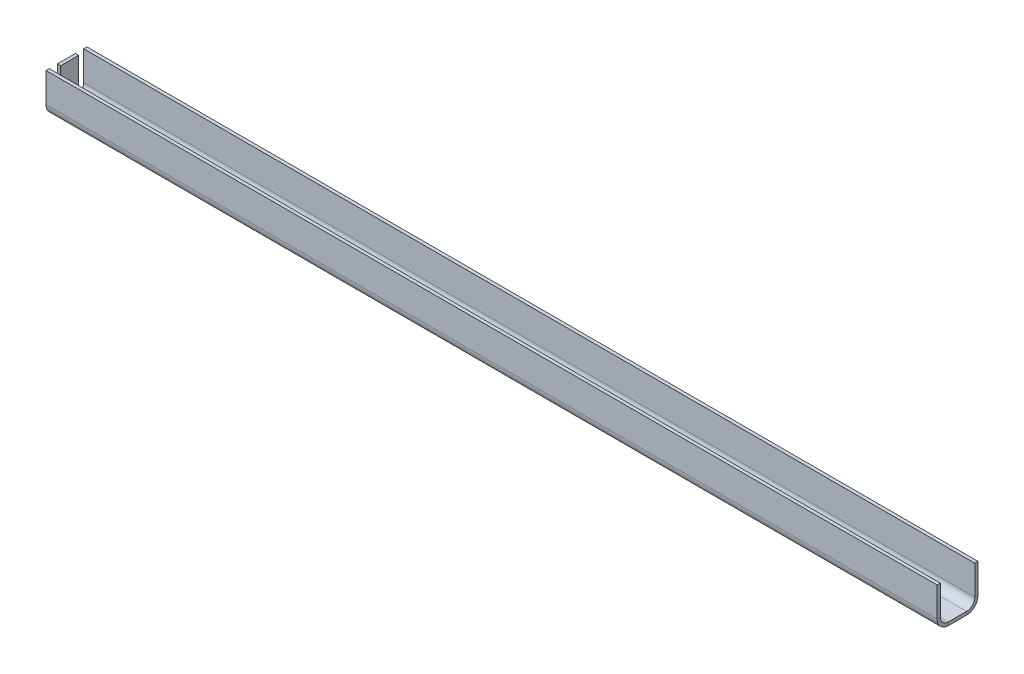
ISO-10303-21;
HEADER;
FILE_DESCRIPTION(('STEP AP214'),'2;1');
FILE_NAME('part.step','',(''),(''),'','','');
FILE_SCHEMA(('AUTOMOTIVE_DESIGN { 1 0 10303 214 1 1 1 1 }'));
ENDSEC;
DATA;
#1=APPLICATION_CONTEXT('core data for automotive mechanical design processes');
#2=APPLICATION_PROTOCOL_DEFINITION('international standard','automotive_design',2000,#1);
#3=PRODUCT_CONTEXT('',#1,'mechanical');
#4=PRODUCT('Part','Part','',(#3));
#5=PRODUCT_RELATED_PRODUCT_CATEGORY('part','',(#4));
#6=PRODUCT_DEFINITION_FORMATION('','',#4);
#7=PRODUCT_DEFINITION_CONTEXT('part definition',#1,'design');
#8=PRODUCT_DEFINITION('design','',#6,#7);
#9=PRODUCT_DEFINITION_SHAPE('','',#8);
#10=(LENGTH_UNIT() NAMED_UNIT(*) SI_UNIT(.MILLI.,.METRE.));
#11=(NAMED_UNIT(*) PLANE_ANGLE_UNIT() SI_UNIT($,.RADIAN.));
#12=(NAMED_UNIT(*) SI_UNIT($,.STERADIAN.) SOLID_ANGLE_UNIT());
#13=UNCERTAINTY_MEASURE_WITH_UNIT(LENGTH_MEASURE(1.E-05),#10,'distance_accuracy_value','');
#14=(GEOMETRIC_REPRESENTATION_CONTEXT(3) GLOBAL_UNCERTAINTY_ASSIGNED_CONTEXT((#13)) GLOBAL_UNIT_ASSIGNED_CONTEXT((#10,
#11,#12)) REPRESENTATION_CONTEXT('',''));
#15=CARTESIAN_POINT('',(0.,0.,0.));
#16=DIRECTION('',(0.,0.,1.));
#17=DIRECTION('',(1.,0.,0.));
#18=AXIS2_PLACEMENT_3D('',#15,#16,#17);
#19=CARTESIAN_POINT('',(-138.43,0.,2.81));
#20=DIRECTION('',(0.,0.,-1.));
#21=DIRECTION('',(-1.,0.,0.));
#22=AXIS2_PLACEMENT_3D('',#19,#20,#21);
#23=PLANE('',#22);
#24=DIRECTION('',(1.,0.,0.));
#25=VECTOR('',#24,1.);
#26=CARTESIAN_POINT('',(-138.43,0.,2.81));
#27=LINE('',#26,#25);
#28=CARTESIAN_POINT('',(-138.43,0.,2.81));
#29=VERTEX_POINT('',#28);
#30=CARTESIAN_POINT('',(-137.355765601188,0.,2.80999999999999));
#31=VERTEX_POINT('',#30);
#32=EDGE_CURVE('E487',#29,#31,#27,.T.);
#33=ORIENTED_EDGE('',*,*,#32,.T.);
#34=CARTESIAN_POINT('',(-134.89,2.53999999999996,2.80999999999999));
#35=DIRECTION('',(0.,0.,1.));
#36=DIRECTION('',(1.,0.,0.));
#37=AXIS2_PLACEMENT_3D('',#34,#35,#36);
#38=CIRCLE('',#37,3.54000000000001);
#39=CARTESIAN_POINT('',(-134.89,-1.00000000000005,2.80999999999999));
#40=VERTEX_POINT('',#39);
#41=EDGE_CURVE('E13',#31,#40,#38,.T.);
#42=ORIENTED_EDGE('',*,*,#41,.T.);
#43=DIRECTION('',(1.,0.,0.));
#44=VECTOR('',#43,1.);
#45=CARTESIAN_POINT('',(138.43,-1.00000000000001,2.80999999999912));
#46=LINE('',#45,#44);
#47=CARTESIAN_POINT('',(-138.43,-1.00000000000001,2.81));
#48=VERTEX_POINT('',#47);
#49=EDGE_CURVE('E489',#48,#40,#46,.T.);
#50=ORIENTED_EDGE('',*,*,#49,.F.);
#51=DIRECTION('',(0.,-1.,0.));
#52=VECTOR('',#51,1.);
#53=CARTESIAN_POINT('',(-138.43,0.,2.81));
#54=LINE('',#53,#52);
#55=EDGE_CURVE('E188',#29,#48,#54,.T.);
#56=ORIENTED_EDGE('',*,*,#55,.F.);
#57=EDGE_LOOP('',(#33,#42,#50,#56));
#58=FACE_BOUND('',#57,.T.);
#59=ADVANCED_FACE('F95',(#58),#23,.T.);
#60=CARTESIAN_POINT('',(-134.89,0.,-2.81000000000001));
#61=DIRECTION('',(0.,0.,1.));
#62=DIRECTION('',(0.,-1.,0.));
#63=AXIS2_PLACEMENT_3D('',#60,#61,#62);
#64=PLANE('',#63);
#65=DIRECTION('',(-1.,0.,0.));
#66=VECTOR('',#65,1.);
#67=CARTESIAN_POINT('',(-138.43,-1.00000000000003,-2.81000000000001));
#68=LINE('',#67,#66);
#69=CARTESIAN_POINT('',(-138.43,-1.00000000000003,-2.81000000000001));
#70=VERTEX_POINT('',#69);
#71=CARTESIAN_POINT('',(-134.89,-1.00000000000005,-2.81000000000001));
#72=VERTEX_POINT('',#71);
#73=EDGE_CURVE('E189',#70,#72,#68,.F.);
#74=ORIENTED_EDGE('',*,*,#73,.T.);
#75=CARTESIAN_POINT('',(-134.89,2.53999999999996,-2.81000000000001));
#76=DIRECTION('',(0.,0.,1.));
#77=DIRECTION('',(1.,0.,0.));
#78=AXIS2_PLACEMENT_3D('',#75,#76,#77);
#79=CIRCLE('',#78,3.54000000000001);
#80=CARTESIAN_POINT('',(-137.355765601188,0.,-2.81000000000001));
#81=VERTEX_POINT('',#80);
#82=EDGE_CURVE('E473',#72,#81,#79,.F.);
#83=ORIENTED_EDGE('',*,*,#82,.T.);
#84=DIRECTION('',(-1.,0.,0.));
#85=VECTOR('',#84,1.);
#86=CARTESIAN_POINT('',(-138.43,0.,-2.81000000000001));
#87=LINE('',#86,#85);
#88=CARTESIAN_POINT('',(-138.43,0.,-2.81000000000001));
#89=VERTEX_POINT('',#88);
#90=EDGE_CURVE('E197',#89,#81,#87,.F.);
#91=ORIENTED_EDGE('',*,*,#90,.F.);
#92=DIRECTION('',(0.,-1.,0.));
#93=VECTOR('',#92,1.);
#94=CARTESIAN_POINT('',(-138.43,0.,-2.81000000000001));
#95=LINE('',#94,#93);
#96=EDGE_CURVE('E161',#89,#70,#95,.T.);
#97=ORIENTED_EDGE('',*,*,#96,.T.);
#98=EDGE_LOOP('',(#74,#83,#91,#97));
#99=FACE_BOUND('',#98,.T.);
#100=ADVANCED_FACE('F227',(#99),#64,.T.);
#101=CARTESIAN_POINT('',(0.,-1.,0.));
#102=DIRECTION('',(0.,-1.,0.));
#103=DIRECTION('',(0.,0.,-1.));
#104=AXIS2_PLACEMENT_3D('',#101,#102,#103);
#105=PLANE('',#104);
#106=DIRECTION('',(1.,0.,0.));
#107=VECTOR('',#106,1.);
#108=CARTESIAN_POINT('',(138.43,-1.00000000000001,2.81));
#109=LINE('',#108,#107);
#110=CARTESIAN_POINT('',(138.43,-1.00000000000001,2.81));
#111=VERTEX_POINT('',#110);
#112=EDGE_CURVE('E304',#111,#40,#109,.F.);
#113=ORIENTED_EDGE('',*,*,#112,.T.);
#114=DIRECTION('',(0.,0.,1.));
#115=VECTOR('',#114,1.);
#116=CARTESIAN_POINT('',(-134.89,-1.00000000000005,2.81));
#117=LINE('',#116,#115);
#118=EDGE_CURVE('E307',#40,#72,#117,.F.);
#119=ORIENTED_EDGE('',*,*,#118,.T.);
#120=CARTESIAN_POINT('',(138.43,-1.,-2.81000000000001));
#121=VERTEX_POINT('',#120);
#122=EDGE_CURVE('E113',#72,#121,#68,.F.);
#123=ORIENTED_EDGE('',*,*,#122,.T.);
#124=DIRECTION('',(0.,0.,-1.));
#125=VECTOR('',#124,1.);
#126=CARTESIAN_POINT('',(138.43,-1.,6.35));
#127=LINE('',#126,#125);
#128=EDGE_CURVE('E104',#111,#121,#127,.T.);
#129=ORIENTED_EDGE('',*,*,#128,.F.);
#130=EDGE_LOOP('',(#113,#119,#123,#129));
#131=FACE_BOUND('',#130,.T.);
#132=ADVANCED_FACE('F225',(#131),#105,.T.);
#133=CARTESIAN_POINT('',(0.,0.,0.));
#134=DIRECTION('',(0.,-1.,0.));
#135=DIRECTION('',(0.,0.,-1.));
#136=AXIS2_PLACEMENT_3D('',#133,#134,#135);
#137=PLANE('',#136);
#138=DIRECTION('',(0.,0.,1.));
#139=VECTOR('',#138,1.);
#140=CARTESIAN_POINT('',(-134.89,0.,2.81));
#141=LINE('',#140,#139);
#142=CARTESIAN_POINT('',(-134.89,0.,2.80999999999999));
#143=VERTEX_POINT('',#142);
#144=CARTESIAN_POINT('',(-134.89,0.,-2.81000000000001));
#145=VERTEX_POINT('',#144);
#146=EDGE_CURVE('E481',#143,#145,#141,.F.);
#147=ORIENTED_EDGE('',*,*,#146,.F.);
#148=DIRECTION('',(1.,0.,0.));
#149=VECTOR('',#148,1.);
#150=CARTESIAN_POINT('',(138.43,0.,2.81));
#151=LINE('',#150,#149);
#152=CARTESIAN_POINT('',(138.43,0.,2.81));
#153=VERTEX_POINT('',#152);
#154=EDGE_CURVE('E216',#153,#143,#151,.F.);
#155=ORIENTED_EDGE('',*,*,#154,.F.);
#156=DIRECTION('',(0.,0.,-1.));
#157=VECTOR('',#156,1.);
#158=CARTESIAN_POINT('',(138.43,0.,6.35));
#159=LINE('',#158,#157);
#160=CARTESIAN_POINT('',(138.43,0.,-2.81000000000001));
#161=VERTEX_POINT('',#160);
#162=EDGE_CURVE('E99',#153,#161,#159,.T.);
#163=ORIENTED_EDGE('',*,*,#162,.T.);
#164=EDGE_CURVE('E162',#145,#161,#87,.F.);
#165=ORIENTED_EDGE('',*,*,#164,.F.);
#166=EDGE_LOOP('',(#147,#155,#163,#165));
#167=FACE_BOUND('',#166,.T.);
#168=ADVANCED_FACE('F212',(#167),#137,.F.);
#169=CARTESIAN_POINT('',(138.43,-1.,6.35));
#170=DIRECTION('',(1.,0.,0.));
#171=DIRECTION('',(0.,0.,-1.));
#172=AXIS2_PLACEMENT_3D('',#169,#170,#171);
#173=PLANE('',#172);
#174=ORIENTED_EDGE('',*,*,#162,.F.);
#175=DIRECTION('',(0.,-1.,0.));
#176=VECTOR('',#175,1.);
#177=CARTESIAN_POINT('',(138.43,0.,2.81));
#178=LINE('',#177,#176);
#179=EDGE_CURVE('E318',#153,#111,#178,.T.);
#180=ORIENTED_EDGE('',*,*,#179,.T.);
#181=ORIENTED_EDGE('',*,*,#128,.T.);
#182=DIRECTION('',(0.,-1.,0.));
#183=VECTOR('',#182,1.);
#184=CARTESIAN_POINT('',(138.43,0.,-2.81000000000001));
#185=LINE('',#184,#183);
#186=EDGE_CURVE('E200',#161,#121,#185,.T.);
#187=ORIENTED_EDGE('',*,*,#186,.F.);
#188=EDGE_LOOP('',(#174,#180,#181,#187));
#189=FACE_BOUND('',#188,.T.);
#190=ADVANCED_FACE('F97',(#189),#173,.T.);
#191=CARTESIAN_POINT('',(138.43,2.53999999999997,-2.81000000000001));
#192=DIRECTION('',(1.,0.,0.));
#193=DIRECTION('',(0.,0.,-1.));
#194=AXIS2_PLACEMENT_3D('',#191,#192,#193);
#195=PLANE('',#194);
#196=DIRECTION('',(0.,0.,1.));
#197=VECTOR('',#196,1.);
#198=CARTESIAN_POINT('',(138.43,2.54,-6.34999999999998));
#199=LINE('',#198,#197);
#200=CARTESIAN_POINT('',(138.43,2.53999999999996,-5.35000000000001));
#201=VERTEX_POINT('',#200);
#202=CARTESIAN_POINT('',(138.43,2.53999999999996,-6.35000000000001));
#203=VERTEX_POINT('',#202);
#204=EDGE_CURVE('E152',#201,#203,#199,.F.);
#205=ORIENTED_EDGE('',*,*,#204,.F.);
#206=CARTESIAN_POINT('',(138.43,2.53999999999997,-2.81000000000001));
#207=DIRECTION('',(-1.,0.,0.));
#208=DIRECTION('',(0.,0.,1.));
#209=AXIS2_PLACEMENT_3D('',#206,#207,#208);
#210=CIRCLE('',#209,2.54);
#211=EDGE_CURVE('E146',#161,#201,#210,.F.);
#212=ORIENTED_EDGE('',*,*,#211,.F.);
#213=ORIENTED_EDGE('',*,*,#186,.T.);
#214=CARTESIAN_POINT('',(138.43,2.53999999999997,-2.81000000000001));
#215=DIRECTION('',(-1.,0.,0.));
#216=DIRECTION('',(0.,0.,1.));
#217=AXIS2_PLACEMENT_3D('',#214,#215,#216);
#218=CIRCLE('',#217,3.54);
#219=EDGE_CURVE('E192',#121,#203,#218,.F.);
#220=ORIENTED_EDGE('',*,*,#219,.T.);
#221=EDGE_LOOP('',(#205,#212,#213,#220));
#222=FACE_BOUND('',#221,.T.);
#223=ADVANCED_FACE('F218',(#222),#195,.T.);
#224=CARTESIAN_POINT('',(-138.43,2.53999999999997,-2.81000000000001));
#225=DIRECTION('',(1.,0.,0.));
#226=DIRECTION('',(0.,0.,-1.));
#227=AXIS2_PLACEMENT_3D('',#224,#225,#226);
#228=PLANE('',#227);
#229=CARTESIAN_POINT('',(-138.43,2.53999999999997,-2.81000000000001));
#230=DIRECTION('',(-1.,0.,0.));
#231=DIRECTION('',(0.,0.,1.));
#232=AXIS2_PLACEMENT_3D('',#229,#230,#231);
#233=CIRCLE('',#232,2.54);
#234=CARTESIAN_POINT('',(-138.43,2.53999999999996,-5.35000000000001));
#235=VERTEX_POINT('',#234);
#236=EDGE_CURVE('E144',#235,#89,#233,.T.);
#237=ORIENTED_EDGE('',*,*,#236,.F.);
#238=DIRECTION('',(0.,0.,1.));
#239=VECTOR('',#238,1.);
#240=CARTESIAN_POINT('',(-138.43,2.53999999999999,-5.35000000000001));
#241=LINE('',#240,#239);
#242=CARTESIAN_POINT('',(-138.43,2.53999999999999,-6.35000000000001));
#243=VERTEX_POINT('',#242);
#244=EDGE_CURVE('E151',#235,#243,#241,.F.);
#245=ORIENTED_EDGE('',*,*,#244,.T.);
#246=CARTESIAN_POINT('',(-138.43,2.53999999999997,-2.81000000000001));
#247=DIRECTION('',(-1.,0.,0.));
#248=DIRECTION('',(0.,0.,1.));
#249=AXIS2_PLACEMENT_3D('',#246,#247,#248);
#250=CIRCLE('',#249,3.54);
#251=EDGE_CURVE('E194',#243,#70,#250,.T.);
#252=ORIENTED_EDGE('',*,*,#251,.T.);
#253=ORIENTED_EDGE('',*,*,#96,.F.);
#254=EDGE_LOOP('',(#237,#245,#252,#253));
#255=FACE_BOUND('',#254,.T.);
#256=ADVANCED_FACE('F158',(#255),#228,.F.);
#257=CARTESIAN_POINT('',(-138.43,2.53999999999997,-2.81000000000001));
#258=DIRECTION('',(-1.,0.,0.));
#259=DIRECTION('',(0.,0.,-1.));
#260=AXIS2_PLACEMENT_3D('',#257,#258,#259);
#261=CYLINDRICAL_SURFACE('',#260,3.54);
#262=ORIENTED_EDGE('',*,*,#73,.F.);
#263=ORIENTED_EDGE('',*,*,#251,.F.);
#264=DIRECTION('',(-1.,0.,0.));
#265=VECTOR('',#264,1.);
#266=CARTESIAN_POINT('',(138.43,2.54,-6.35000000000001));
#267=LINE('',#266,#265);
#268=EDGE_CURVE('E122',#243,#203,#267,.F.);
#269=ORIENTED_EDGE('',*,*,#268,.T.);
#270=ORIENTED_EDGE('',*,*,#219,.F.);
#271=ORIENTED_EDGE('',*,*,#122,.F.);
#272=EDGE_LOOP('',(#262,#263,#269,#270,#271));
#273=FACE_BOUND('',#272,.T.);
#274=ADVANCED_FACE('F291',(#273),#261,.T.);
#275=CARTESIAN_POINT('',(-138.43,2.53999999999997,-2.81000000000001));
#276=DIRECTION('',(-1.,0.,0.));
#277=DIRECTION('',(0.,0.,-1.));
#278=AXIS2_PLACEMENT_3D('',#275,#276,#277);
#279=CYLINDRICAL_SURFACE('',#278,2.54);
#280=ORIENTED_EDGE('',*,*,#90,.T.);
#281=EDGE_CURVE('E198',#81,#145,#87,.F.);
#282=ORIENTED_EDGE('',*,*,#281,.T.);
#283=ORIENTED_EDGE('',*,*,#164,.T.);
#284=ORIENTED_EDGE('',*,*,#211,.T.);
#285=DIRECTION('',(-1.,0.,0.));
#286=VECTOR('',#285,1.);
#287=CARTESIAN_POINT('',(138.43,2.53999999999999,-5.35000000000001));
#288=LINE('',#287,#286);
#289=EDGE_CURVE('E139',#201,#235,#288,.T.);
#290=ORIENTED_EDGE('',*,*,#289,.T.);
#291=ORIENTED_EDGE('',*,*,#236,.T.);
#292=EDGE_LOOP('',(#280,#282,#283,#284,#290,#291));
#293=FACE_BOUND('',#292,.T.);
#294=ADVANCED_FACE('F142',(#293),#279,.F.);
#295=CARTESIAN_POINT('',(-138.43,11.7,-6.35000000000004));
#296=DIRECTION('',(1.,0.,0.));
#297=DIRECTION('',(0.,0.,-1.));
#298=AXIS2_PLACEMENT_3D('',#295,#296,#297);
#299=PLANE('',#298);
#300=ORIENTED_EDGE('',*,*,#244,.F.);
#301=DIRECTION('',(0.,-1.,0.));
#302=VECTOR('',#301,1.);
#303=CARTESIAN_POINT('',(-138.43,11.7,-5.35000000000004));
#304=LINE('',#303,#302);
#305=CARTESIAN_POINT('',(-138.43,11.7,-5.35000000000004));
#306=VERTEX_POINT('',#305);
#307=EDGE_CURVE('E171',#235,#306,#304,.F.);
#308=ORIENTED_EDGE('',*,*,#307,.T.);
#309=DIRECTION('',(0.,0.,1.));
#310=VECTOR('',#309,1.);
#311=CARTESIAN_POINT('',(-138.43,11.7,-6.35000000000004));
#312=LINE('',#311,#310);
#313=CARTESIAN_POINT('',(-138.43,11.7,-6.35000000000004));
#314=VERTEX_POINT('',#313);
#315=EDGE_CURVE('E163',#314,#306,#312,.T.);
#316=ORIENTED_EDGE('',*,*,#315,.F.);
#317=DIRECTION('',(0.,1.,0.));
#318=VECTOR('',#317,1.);
#319=CARTESIAN_POINT('',(-138.43,0.,-6.35));
#320=LINE('',#319,#318);
#321=EDGE_CURVE('E174',#243,#314,#320,.T.);
#322=ORIENTED_EDGE('',*,*,#321,.F.);
#323=EDGE_LOOP('',(#300,#308,#316,#322));
#324=FACE_BOUND('',#323,.T.);
#325=ADVANCED_FACE('F168',(#324),#299,.F.);
#326=CARTESIAN_POINT('',(138.43,0.,-6.35));
#327=DIRECTION('',(-1.,0.,0.));
#328=DIRECTION('',(0.,0.,1.));
#329=AXIS2_PLACEMENT_3D('',#326,#327,#328);
#330=PLANE('',#329);
#331=ORIENTED_EDGE('',*,*,#204,.T.);
#332=DIRECTION('',(0.,-1.,0.));
#333=VECTOR('',#332,1.);
#334=CARTESIAN_POINT('',(138.43,0.,-6.35));
#335=LINE('',#334,#333);
#336=CARTESIAN_POINT('',(138.43,11.7,-6.35000000000004));
#337=VERTEX_POINT('',#336);
#338=EDGE_CURVE('E340',#337,#203,#335,.T.);
#339=ORIENTED_EDGE('',*,*,#338,.F.);
#340=DIRECTION('',(0.,0.,1.));
#341=VECTOR('',#340,1.);
#342=CARTESIAN_POINT('',(138.43,11.7,-6.35000000000004));
#343=LINE('',#342,#341);
#344=CARTESIAN_POINT('',(138.43,11.7,-5.35000000000004));
#345=VERTEX_POINT('',#344);
#346=EDGE_CURVE('E337',#337,#345,#343,.T.);
#347=ORIENTED_EDGE('',*,*,#346,.T.);
#348=DIRECTION('',(0.,1.,0.));
#349=VECTOR('',#348,1.);
#350=CARTESIAN_POINT('',(138.43,0.,-5.35));
#351=LINE('',#350,#349);
#352=EDGE_CURVE('E181',#345,#201,#351,.F.);
#353=ORIENTED_EDGE('',*,*,#352,.T.);
#354=EDGE_LOOP('',(#331,#339,#347,#353));
#355=FACE_BOUND('',#354,.T.);
#356=ADVANCED_FACE('F279',(#355),#330,.F.);
#357=CARTESIAN_POINT('',(0.,0.,-6.35));
#358=DIRECTION('',(0.,0.,1.));
#359=DIRECTION('',(0.,-1.,0.));
#360=AXIS2_PLACEMENT_3D('',#357,#358,#359);
#361=PLANE('',#360);
#362=ORIENTED_EDGE('',*,*,#268,.F.);
#363=ORIENTED_EDGE('',*,*,#321,.T.);
#364=DIRECTION('',(1.,0.,0.));
#365=VECTOR('',#364,1.);
#366=CARTESIAN_POINT('',(0.,11.7,-6.35000000000004));
#367=LINE('',#366,#365);
#368=EDGE_CURVE('E343',#314,#337,#367,.T.);
#369=ORIENTED_EDGE('',*,*,#368,.T.);
#370=ORIENTED_EDGE('',*,*,#338,.T.);
#371=EDGE_LOOP('',(#362,#363,#369,#370));
#372=FACE_BOUND('',#371,.T.);
#373=ADVANCED_FACE('F276',(#372),#361,.F.);
#374=CARTESIAN_POINT('',(0.,0.,-5.35));
#375=DIRECTION('',(0.,0.,1.));
#376=DIRECTION('',(0.,-1.,0.));
#377=AXIS2_PLACEMENT_3D('',#374,#375,#376);
#378=PLANE('',#377);
#379=ORIENTED_EDGE('',*,*,#307,.F.);
#380=ORIENTED_EDGE('',*,*,#289,.F.);
#381=ORIENTED_EDGE('',*,*,#352,.F.);
#382=DIRECTION('',(-1.,0.,0.));
#383=VECTOR('',#382,1.);
#384=CARTESIAN_POINT('',(138.43,11.7,-5.35000000000004));
#385=LINE('',#384,#383);
#386=EDGE_CURVE('E179',#306,#345,#385,.F.);
#387=ORIENTED_EDGE('',*,*,#386,.F.);
#388=EDGE_LOOP('',(#379,#380,#381,#387));
#389=FACE_BOUND('',#388,.T.);
#390=ADVANCED_FACE('F177',(#389),#378,.T.);
#391=CARTESIAN_POINT('',(138.43,11.7,-6.35000000000004));
#392=DIRECTION('',(0.,-1.,0.));
#393=DIRECTION('',(0.,0.,-1.));
#394=AXIS2_PLACEMENT_3D('',#391,#392,#393);
#395=PLANE('',#394);
#396=ORIENTED_EDGE('',*,*,#386,.T.);
#397=ORIENTED_EDGE('',*,*,#346,.F.);
#398=ORIENTED_EDGE('',*,*,#368,.F.);
#399=ORIENTED_EDGE('',*,*,#315,.T.);
#400=EDGE_LOOP('',(#396,#397,#398,#399));
#401=FACE_BOUND('',#400,.T.);
#402=ADVANCED_FACE('F271',(#401),#395,.F.);
#403=CARTESIAN_POINT('',(-138.43,2.54,2.81));
#404=DIRECTION('',(-1.,0.,0.));
#405=DIRECTION('',(0.,0.,1.));
#406=AXIS2_PLACEMENT_3D('',#403,#404,#405);
#407=PLANE('',#406);
#408=DIRECTION('',(0.,0.,-1.));
#409=VECTOR('',#408,1.);
#410=CARTESIAN_POINT('',(-138.43,2.53999999999999,6.35));
#411=LINE('',#410,#409);
#412=CARTESIAN_POINT('',(-138.43,2.54,5.35));
#413=VERTEX_POINT('',#412);
#414=CARTESIAN_POINT('',(-138.43,2.54,6.35));
#415=VERTEX_POINT('',#414);
#416=EDGE_CURVE('E323',#413,#415,#411,.F.);
#417=ORIENTED_EDGE('',*,*,#416,.F.);
#418=CARTESIAN_POINT('',(-138.43,2.54,2.81));
#419=DIRECTION('',(1.,0.,0.));
#420=DIRECTION('',(0.,0.,-1.));
#421=AXIS2_PLACEMENT_3D('',#418,#419,#420);
#422=CIRCLE('',#421,2.54);
#423=EDGE_CURVE('E320',#29,#413,#422,.F.);
#424=ORIENTED_EDGE('',*,*,#423,.F.);
#425=ORIENTED_EDGE('',*,*,#55,.T.);
#426=CARTESIAN_POINT('',(-138.43,2.54,2.81));
#427=DIRECTION('',(1.,0.,0.));
#428=DIRECTION('',(0.,0.,-1.));
#429=AXIS2_PLACEMENT_3D('',#426,#427,#428);
#430=CIRCLE('',#429,3.54);
#431=EDGE_CURVE('E314',#48,#415,#430,.F.);
#432=ORIENTED_EDGE('',*,*,#431,.T.);
#433=EDGE_LOOP('',(#417,#424,#425,#432));
#434=FACE_BOUND('',#433,.T.);
#435=ADVANCED_FACE('F268',(#434),#407,.T.);
#436=CARTESIAN_POINT('',(138.43,2.54,2.81));
#437=DIRECTION('',(-1.,0.,0.));
#438=DIRECTION('',(0.,0.,1.));
#439=AXIS2_PLACEMENT_3D('',#436,#437,#438);
#440=PLANE('',#439);
#441=CARTESIAN_POINT('',(138.43,2.54,2.81));
#442=DIRECTION('',(1.,0.,0.));
#443=DIRECTION('',(0.,0.,-1.));
#444=AXIS2_PLACEMENT_3D('',#441,#442,#443);
#445=CIRCLE('',#444,2.54);
#446=CARTESIAN_POINT('',(138.43,2.54,5.35));
#447=VERTEX_POINT('',#446);
#448=EDGE_CURVE('E329',#447,#153,#445,.T.);
#449=ORIENTED_EDGE('',*,*,#448,.F.);
#450=DIRECTION('',(0.,0.,-1.));
#451=VECTOR('',#450,1.);
#452=CARTESIAN_POINT('',(138.43,2.54,5.35000000000001));
#453=LINE('',#452,#451);
#454=CARTESIAN_POINT('',(138.43,2.54,6.35));
#455=VERTEX_POINT('',#454);
#456=EDGE_CURVE('E512',#447,#455,#453,.F.);
#457=ORIENTED_EDGE('',*,*,#456,.T.);
#458=CARTESIAN_POINT('',(138.43,2.54,2.81));
#459=DIRECTION('',(1.,0.,0.));
#460=DIRECTION('',(0.,0.,-1.));
#461=AXIS2_PLACEMENT_3D('',#458,#459,#460);
#462=CIRCLE('',#461,3.54);
#463=EDGE_CURVE('E315',#455,#111,#462,.T.);
#464=ORIENTED_EDGE('',*,*,#463,.T.);
#465=ORIENTED_EDGE('',*,*,#179,.F.);
#466=EDGE_LOOP('',(#449,#457,#464,#465));
#467=FACE_BOUND('',#466,.T.);
#468=ADVANCED_FACE('F263',(#467),#440,.F.);
#469=CARTESIAN_POINT('',(138.43,2.54,2.81));
#470=DIRECTION('',(1.,0.,0.));
#471=DIRECTION('',(0.,0.,1.));
#472=AXIS2_PLACEMENT_3D('',#469,#470,#471);
#473=CYLINDRICAL_SURFACE('',#472,3.54);
#474=ORIENTED_EDGE('',*,*,#112,.F.);
#475=ORIENTED_EDGE('',*,*,#463,.F.);
#476=DIRECTION('',(1.,0.,0.));
#477=VECTOR('',#476,1.);
#478=CARTESIAN_POINT('',(-138.43,2.53999999999999,6.35));
#479=LINE('',#478,#477);
#480=EDGE_CURVE('E510',#455,#415,#479,.F.);
#481=ORIENTED_EDGE('',*,*,#480,.T.);
#482=ORIENTED_EDGE('',*,*,#431,.F.);
#483=ORIENTED_EDGE('',*,*,#49,.T.);
#484=EDGE_LOOP('',(#474,#475,#481,#482,#483));
#485=FACE_BOUND('',#484,.T.);
#486=ADVANCED_FACE('F260',(#485),#473,.T.);
#487=CARTESIAN_POINT('',(138.43,2.54,2.81));
#488=DIRECTION('',(1.,0.,0.));
#489=DIRECTION('',(0.,0.,1.));
#490=AXIS2_PLACEMENT_3D('',#487,#488,#489);
#491=CYLINDRICAL_SURFACE('',#490,2.54);
#492=ORIENTED_EDGE('',*,*,#154,.T.);
#493=EDGE_CURVE('E475',#31,#143,#27,.T.);
#494=ORIENTED_EDGE('',*,*,#493,.F.);
#495=ORIENTED_EDGE('',*,*,#32,.F.);
#496=ORIENTED_EDGE('',*,*,#423,.T.);
#497=DIRECTION('',(1.,0.,0.));
#498=VECTOR('',#497,1.);
#499=CARTESIAN_POINT('',(-138.43,2.53999999999999,5.35));
#500=LINE('',#499,#498);
#501=EDGE_CURVE('E514',#413,#447,#500,.T.);
#502=ORIENTED_EDGE('',*,*,#501,.T.);
#503=ORIENTED_EDGE('',*,*,#448,.T.);
#504=EDGE_LOOP('',(#492,#494,#495,#496,#502,#503));
#505=FACE_BOUND('',#504,.T.);
#506=ADVANCED_FACE('F258',(#505),#491,.F.);
#507=CARTESIAN_POINT('',(138.43,11.7,6.35));
#508=DIRECTION('',(-1.,0.,0.));
#509=DIRECTION('',(0.,0.,1.));
#510=AXIS2_PLACEMENT_3D('',#507,#508,#509);
#511=PLANE('',#510);
#512=ORIENTED_EDGE('',*,*,#456,.F.);
#513=DIRECTION('',(0.,-1.,0.));
#514=VECTOR('',#513,1.);
#515=CARTESIAN_POINT('',(138.43,11.7,5.35));
#516=LINE('',#515,#514);
#517=CARTESIAN_POINT('',(138.43,11.7,5.35));
#518=VERTEX_POINT('',#517);
#519=EDGE_CURVE('E508',#447,#518,#516,.F.);
#520=ORIENTED_EDGE('',*,*,#519,.T.);
#521=DIRECTION('',(0.,0.,-1.));
#522=VECTOR('',#521,1.);
#523=CARTESIAN_POINT('',(138.43,11.7,6.35));
#524=LINE('',#523,#522);
#525=CARTESIAN_POINT('',(138.43,11.7,6.35));
#526=VERTEX_POINT('',#525);
#527=EDGE_CURVE('E332',#526,#518,#524,.T.);
#528=ORIENTED_EDGE('',*,*,#527,.F.);
#529=DIRECTION('',(0.,1.,0.));
#530=VECTOR('',#529,1.);
#531=CARTESIAN_POINT('',(138.43,0.,6.35));
#532=LINE('',#531,#530);
#533=EDGE_CURVE('E501',#455,#526,#532,.T.);
#534=ORIENTED_EDGE('',*,*,#533,.F.);
#535=EDGE_LOOP('',(#512,#520,#528,#534));
#536=FACE_BOUND('',#535,.T.);
#537=ADVANCED_FACE('F250',(#536),#511,.F.);
#538=CARTESIAN_POINT('',(-138.43,0.,6.35));
#539=DIRECTION('',(1.,0.,0.));
#540=DIRECTION('',(0.,0.,-1.));
#541=AXIS2_PLACEMENT_3D('',#538,#539,#540);
#542=PLANE('',#541);
#543=ORIENTED_EDGE('',*,*,#416,.T.);
#544=DIRECTION('',(0.,-1.,0.));
#545=VECTOR('',#544,1.);
#546=CARTESIAN_POINT('',(-138.43,0.,6.35));
#547=LINE('',#546,#545);
#548=CARTESIAN_POINT('',(-138.43,11.7,6.35));
#549=VERTEX_POINT('',#548);
#550=EDGE_CURVE('E496',#549,#415,#547,.T.);
#551=ORIENTED_EDGE('',*,*,#550,.F.);
#552=DIRECTION('',(0.,0.,-1.));
#553=VECTOR('',#552,1.);
#554=CARTESIAN_POINT('',(-138.43,11.7,6.35));
#555=LINE('',#554,#553);
#556=CARTESIAN_POINT('',(-138.43,11.7,5.35));
#557=VERTEX_POINT('',#556);
#558=EDGE_CURVE('E493',#549,#557,#555,.T.);
#559=ORIENTED_EDGE('',*,*,#558,.T.);
#560=DIRECTION('',(0.,1.,0.));
#561=VECTOR('',#560,1.);
#562=CARTESIAN_POINT('',(-138.43,0.,5.35));
#563=LINE('',#562,#561);
#564=EDGE_CURVE('E503',#557,#413,#563,.F.);
#565=ORIENTED_EDGE('',*,*,#564,.T.);
#566=EDGE_LOOP('',(#543,#551,#559,#565));
#567=FACE_BOUND('',#566,.T.);
#568=ADVANCED_FACE('F242',(#567),#542,.F.);
#569=CARTESIAN_POINT('',(0.,0.,6.35));
#570=DIRECTION('',(0.,0.,-1.));
#571=DIRECTION('',(-1.,0.,0.));
#572=AXIS2_PLACEMENT_3D('',#569,#570,#571);
#573=PLANE('',#572);
#574=ORIENTED_EDGE('',*,*,#480,.F.);
#575=ORIENTED_EDGE('',*,*,#533,.T.);
#576=DIRECTION('',(-1.,0.,0.));
#577=VECTOR('',#576,1.);
#578=CARTESIAN_POINT('',(0.,11.7,6.35));
#579=LINE('',#578,#577);
#580=EDGE_CURVE('E499',#526,#549,#579,.T.);
#581=ORIENTED_EDGE('',*,*,#580,.T.);
#582=ORIENTED_EDGE('',*,*,#550,.T.);
#583=EDGE_LOOP('',(#574,#575,#581,#582));
#584=FACE_BOUND('',#583,.T.);
#585=ADVANCED_FACE('F238',(#584),#573,.F.);
#586=CARTESIAN_POINT('',(0.,0.,5.35));
#587=DIRECTION('',(0.,0.,-1.));
#588=DIRECTION('',(-1.,0.,0.));
#589=AXIS2_PLACEMENT_3D('',#586,#587,#588);
#590=PLANE('',#589);
#591=ORIENTED_EDGE('',*,*,#519,.F.);
#592=ORIENTED_EDGE('',*,*,#501,.F.);
#593=ORIENTED_EDGE('',*,*,#564,.F.);
#594=DIRECTION('',(1.,0.,0.));
#595=VECTOR('',#594,1.);
#596=CARTESIAN_POINT('',(-138.43,11.7,5.35));
#597=LINE('',#596,#595);
#598=EDGE_CURVE('E506',#518,#557,#597,.F.);
#599=ORIENTED_EDGE('',*,*,#598,.F.);
#600=EDGE_LOOP('',(#591,#592,#593,#599));
#601=FACE_BOUND('',#600,.T.);
#602=ADVANCED_FACE('F241',(#601),#590,.T.);
#603=CARTESIAN_POINT('',(-138.43,11.7,6.35));
#604=DIRECTION('',(0.,-1.,0.));
#605=DIRECTION('',(0.,0.,-1.));
#606=AXIS2_PLACEMENT_3D('',#603,#604,#605);
#607=PLANE('',#606);
#608=ORIENTED_EDGE('',*,*,#598,.T.);
#609=ORIENTED_EDGE('',*,*,#558,.F.);
#610=ORIENTED_EDGE('',*,*,#580,.F.);
#611=ORIENTED_EDGE('',*,*,#527,.T.);
#612=EDGE_LOOP('',(#608,#609,#610,#611));
#613=FACE_BOUND('',#612,.T.);
#614=ADVANCED_FACE('F246',(#613),#607,.F.);
#615=CARTESIAN_POINT('',(-134.89,2.53999999999996,-2.81000000000001));
#616=DIRECTION('',(0.,0.,-1.));
#617=DIRECTION('',(-1.,0.,0.));
#618=AXIS2_PLACEMENT_3D('',#615,#616,#617);
#619=PLANE('',#618);
#620=ORIENTED_EDGE('',*,*,#281,.F.);
#621=CARTESIAN_POINT('',(-138.43,2.53999999999996,-2.81000000000001));
#622=VERTEX_POINT('',#621);
#623=EDGE_CURVE('E472',#81,#622,#79,.F.);
#624=ORIENTED_EDGE('',*,*,#623,.T.);
#625=DIRECTION('',(1.,0.,0.));
#626=VECTOR('',#625,1.);
#627=CARTESIAN_POINT('',(-138.43,2.53999999999996,-2.81000000000002));
#628=LINE('',#627,#626);
#629=CARTESIAN_POINT('',(-137.43,2.53999999999996,-2.81000000000001));
#630=VERTEX_POINT('',#629);
#631=EDGE_CURVE('E452',#630,#622,#628,.F.);
#632=ORIENTED_EDGE('',*,*,#631,.F.);
#633=CARTESIAN_POINT('',(-134.89,2.53999999999996,-2.81000000000001));
#634=DIRECTION('',(0.,0.,1.));
#635=DIRECTION('',(1.,0.,0.));
#636=AXIS2_PLACEMENT_3D('',#633,#634,#635);
#637=CIRCLE('',#636,2.54000000000001);
#638=EDGE_CURVE('E478',#145,#630,#637,.F.);
#639=ORIENTED_EDGE('',*,*,#638,.F.);
#640=EDGE_LOOP('',(#620,#624,#632,#639));
#641=FACE_BOUND('',#640,.T.);
#642=ADVANCED_FACE('F254',(#641),#619,.T.);
#643=CARTESIAN_POINT('',(-134.89,2.53999999999996,2.80999999999999));
#644=DIRECTION('',(0.,0.,-1.));
#645=DIRECTION('',(-1.,0.,0.));
#646=AXIS2_PLACEMENT_3D('',#643,#644,#645);
#647=PLANE('',#646);
#648=CARTESIAN_POINT('',(-138.43,2.53999999999996,2.80999999999999));
#649=VERTEX_POINT('',#648);
#650=EDGE_CURVE('E106',#649,#31,#38,.T.);
#651=ORIENTED_EDGE('',*,*,#650,.T.);
#652=ORIENTED_EDGE('',*,*,#493,.T.);
#653=CARTESIAN_POINT('',(-134.89,2.53999999999996,2.80999999999999));
#654=DIRECTION('',(0.,0.,1.));
#655=DIRECTION('',(1.,0.,0.));
#656=AXIS2_PLACEMENT_3D('',#653,#654,#655);
#657=CIRCLE('',#656,2.54000000000001);
#658=CARTESIAN_POINT('',(-137.43,2.53999999999996,2.80999999999999));
#659=VERTEX_POINT('',#658);
#660=EDGE_CURVE('E484',#659,#143,#657,.T.);
#661=ORIENTED_EDGE('',*,*,#660,.F.);
#662=DIRECTION('',(1.,0.,0.));
#663=VECTOR('',#662,1.);
#664=CARTESIAN_POINT('',(-137.43,2.53999999999996,2.80999999999999));
#665=LINE('',#664,#663);
#666=EDGE_CURVE('E465',#659,#649,#665,.F.);
#667=ORIENTED_EDGE('',*,*,#666,.T.);
#668=EDGE_LOOP('',(#651,#652,#661,#667));
#669=FACE_BOUND('',#668,.T.);
#670=ADVANCED_FACE('F536',(#669),#647,.F.);
#671=CARTESIAN_POINT('',(-134.89,2.53999999999996,2.81));
#672=DIRECTION('',(0.,0.,1.));
#673=DIRECTION('',(-1.,0.,0.));
#674=AXIS2_PLACEMENT_3D('',#671,#672,#673);
#675=CYLINDRICAL_SURFACE('',#674,3.54000000000001);
#676=ORIENTED_EDGE('',*,*,#118,.F.);
#677=ORIENTED_EDGE('',*,*,#41,.F.);
#678=ORIENTED_EDGE('',*,*,#650,.F.);
#679=DIRECTION('',(0.,0.,1.));
#680=VECTOR('',#679,1.);
#681=CARTESIAN_POINT('',(-138.43,2.53999999999996,-2.81000000000003));
#682=LINE('',#681,#680);
#683=EDGE_CURVE('E462',#649,#622,#682,.F.);
#684=ORIENTED_EDGE('',*,*,#683,.T.);
#685=ORIENTED_EDGE('',*,*,#623,.F.);
#686=ORIENTED_EDGE('',*,*,#82,.F.);
#687=EDGE_LOOP('',(#676,#677,#678,#684,#685,#686));
#688=FACE_BOUND('',#687,.T.);
#689=ADVANCED_FACE('F535',(#688),#675,.T.);
#690=CARTESIAN_POINT('',(-134.89,2.53999999999996,2.81));
#691=DIRECTION('',(0.,0.,1.));
#692=DIRECTION('',(-1.,0.,0.));
#693=AXIS2_PLACEMENT_3D('',#690,#691,#692);
#694=CYLINDRICAL_SURFACE('',#693,2.54000000000001);
#695=ORIENTED_EDGE('',*,*,#146,.T.);
#696=ORIENTED_EDGE('',*,*,#638,.T.);
#697=DIRECTION('',(0.,0.,1.));
#698=VECTOR('',#697,1.);
#699=CARTESIAN_POINT('',(-137.43,2.53999999999996,-2.81000000000003));
#700=LINE('',#699,#698);
#701=EDGE_CURVE('E468',#630,#659,#700,.T.);
#702=ORIENTED_EDGE('',*,*,#701,.T.);
#703=ORIENTED_EDGE('',*,*,#660,.T.);
#704=EDGE_LOOP('',(#695,#696,#702,#703));
#705=FACE_BOUND('',#704,.T.);
#706=ADVANCED_FACE('F546',(#705),#694,.F.);
#707=CARTESIAN_POINT('',(-138.43,11.7,2.80999999999995));
#708=DIRECTION('',(0.,0.,-1.));
#709=DIRECTION('',(0.,1.,0.));
#710=AXIS2_PLACEMENT_3D('',#707,#708,#709);
#711=PLANE('',#710);
#712=ORIENTED_EDGE('',*,*,#666,.F.);
#713=DIRECTION('',(0.,-1.,0.));
#714=VECTOR('',#713,1.);
#715=CARTESIAN_POINT('',(-137.43,11.7,2.80999999999995));
#716=LINE('',#715,#714);
#717=CARTESIAN_POINT('',(-137.43,11.7,2.80999999999995));
#718=VERTEX_POINT('',#717);
#719=EDGE_CURVE('E460',#659,#718,#716,.F.);
#720=ORIENTED_EDGE('',*,*,#719,.T.);
#721=DIRECTION('',(1.,0.,0.));
#722=VECTOR('',#721,1.);
#723=CARTESIAN_POINT('',(-138.43,11.7,2.80999999999995));
#724=LINE('',#723,#722);
#725=CARTESIAN_POINT('',(-138.43,11.7,2.80999999999995));
#726=VERTEX_POINT('',#725);
#727=EDGE_CURVE('E448',#726,#718,#724,.T.);
#728=ORIENTED_EDGE('',*,*,#727,.F.);
#729=DIRECTION('',(0.,1.,0.));
#730=VECTOR('',#729,1.);
#731=CARTESIAN_POINT('',(-138.43,-3.1990689669406E-13,2.81));
#732=LINE('',#731,#730);
#733=EDGE_CURVE('E435',#649,#726,#732,.T.);
#734=ORIENTED_EDGE('',*,*,#733,.F.);
#735=EDGE_LOOP('',(#712,#720,#728,#734));
#736=FACE_BOUND('',#735,.T.);
#737=ADVANCED_FACE('F541',(#736),#711,.F.);
#738=CARTESIAN_POINT('',(-138.43,0.,-2.81000000000001));
#739=DIRECTION('',(0.,0.,1.));
#740=DIRECTION('',(0.,-1.,0.));
#741=AXIS2_PLACEMENT_3D('',#738,#739,#740);
#742=PLANE('',#741);
#743=ORIENTED_EDGE('',*,*,#631,.T.);
#744=DIRECTION('',(0.,-1.,0.));
#745=VECTOR('',#744,1.);
#746=CARTESIAN_POINT('',(-138.43,-3.43863131363372E-13,-2.81000000000001));
#747=LINE('',#746,#745);
#748=CARTESIAN_POINT('',(-138.43,11.7,-2.81000000000006));
#749=VERTEX_POINT('',#748);
#750=EDGE_CURVE('E433',#749,#622,#747,.T.);
#751=ORIENTED_EDGE('',*,*,#750,.F.);
#752=DIRECTION('',(1.,0.,0.));
#753=VECTOR('',#752,1.);
#754=CARTESIAN_POINT('',(-138.43,11.7,-2.81000000000006));
#755=LINE('',#754,#753);
#756=CARTESIAN_POINT('',(-137.43,11.7,-2.81000000000006));
#757=VERTEX_POINT('',#756);
#758=EDGE_CURVE('E441',#749,#757,#755,.T.);
#759=ORIENTED_EDGE('',*,*,#758,.T.);
#760=DIRECTION('',(0.,1.,0.));
#761=VECTOR('',#760,1.);
#762=CARTESIAN_POINT('',(-137.43,0.,-2.81000000000001));
#763=LINE('',#762,#761);
#764=EDGE_CURVE('E457',#757,#630,#763,.F.);
#765=ORIENTED_EDGE('',*,*,#764,.T.);
#766=EDGE_LOOP('',(#743,#751,#759,#765));
#767=FACE_BOUND('',#766,.T.);
#768=ADVANCED_FACE('F451',(#767),#742,.F.);
#769=CARTESIAN_POINT('',(-138.43,-3.31885014028716E-13,0.));
#770=DIRECTION('',(1.,0.,0.));
#771=DIRECTION('',(0.,1.,0.));
#772=AXIS2_PLACEMENT_3D('',#769,#770,#771);
#773=PLANE('',#772);
#774=ORIENTED_EDGE('',*,*,#683,.F.);
#775=ORIENTED_EDGE('',*,*,#733,.T.);
#776=DIRECTION('',(0.,0.,-1.));
#777=VECTOR('',#776,1.);
#778=CARTESIAN_POINT('',(-138.43,11.7,0.));
#779=LINE('',#778,#777);
#780=EDGE_CURVE('E428',#726,#749,#779,.T.);
#781=ORIENTED_EDGE('',*,*,#780,.T.);
#782=ORIENTED_EDGE('',*,*,#750,.T.);
#783=EDGE_LOOP('',(#774,#775,#781,#782));
#784=FACE_BOUND('',#783,.T.);
#785=ADVANCED_FACE('F431',(#784),#773,.F.);
#786=CARTESIAN_POINT('',(-137.43,-3.28393532689873E-13,0.));
#787=DIRECTION('',(1.,0.,0.));
#788=DIRECTION('',(0.,1.,0.));
#789=AXIS2_PLACEMENT_3D('',#786,#787,#788);
#790=PLANE('',#789);
#791=ORIENTED_EDGE('',*,*,#719,.F.);
#792=ORIENTED_EDGE('',*,*,#701,.F.);
#793=ORIENTED_EDGE('',*,*,#764,.F.);
#794=DIRECTION('',(0.,0.,1.));
#795=VECTOR('',#794,1.);
#796=CARTESIAN_POINT('',(-137.43,11.7,-2.81000000000006));
#797=LINE('',#796,#795);
#798=EDGE_CURVE('E444',#718,#757,#797,.F.);
#799=ORIENTED_EDGE('',*,*,#798,.F.);
#800=EDGE_LOOP('',(#791,#792,#793,#799));
#801=FACE_BOUND('',#800,.T.);
#802=ADVANCED_FACE('F543',(#801),#790,.T.);
#803=CARTESIAN_POINT('',(-138.43,11.7,-2.81000000000006));
#804=DIRECTION('',(0.,-1.,0.));
#805=DIRECTION('',(0.,0.,-1.));
#806=AXIS2_PLACEMENT_3D('',#803,#804,#805);
#807=PLANE('',#806);
#808=ORIENTED_EDGE('',*,*,#798,.T.);
#809=ORIENTED_EDGE('',*,*,#758,.F.);
#810=ORIENTED_EDGE('',*,*,#780,.F.);
#811=ORIENTED_EDGE('',*,*,#727,.T.);
#812=EDGE_LOOP('',(#808,#809,#810,#811));
#813=FACE_BOUND('',#812,.T.);
#814=ADVANCED_FACE('F442',(#813),#807,.F.);
#815=CLOSED_SHELL('',(#59,#100,#132,#168,#190,#223,#256,#274,#294,#325,#356,#373,#390,#402,#435,
#468,#486,#506,#537,#568,#585,#602,#614,#642,#670,#689,#706,#737,#768,#785,#802,#814));
#816=MANIFOLD_SOLID_BREP('B2',#815);
#817=ADVANCED_BREP_SHAPE_REPRESENTATION('',(#18,#816),#14);
#818=SHAPE_DEFINITION_REPRESENTATION(#9,#817);
ENDSEC;
END-ISO-10303-21;
